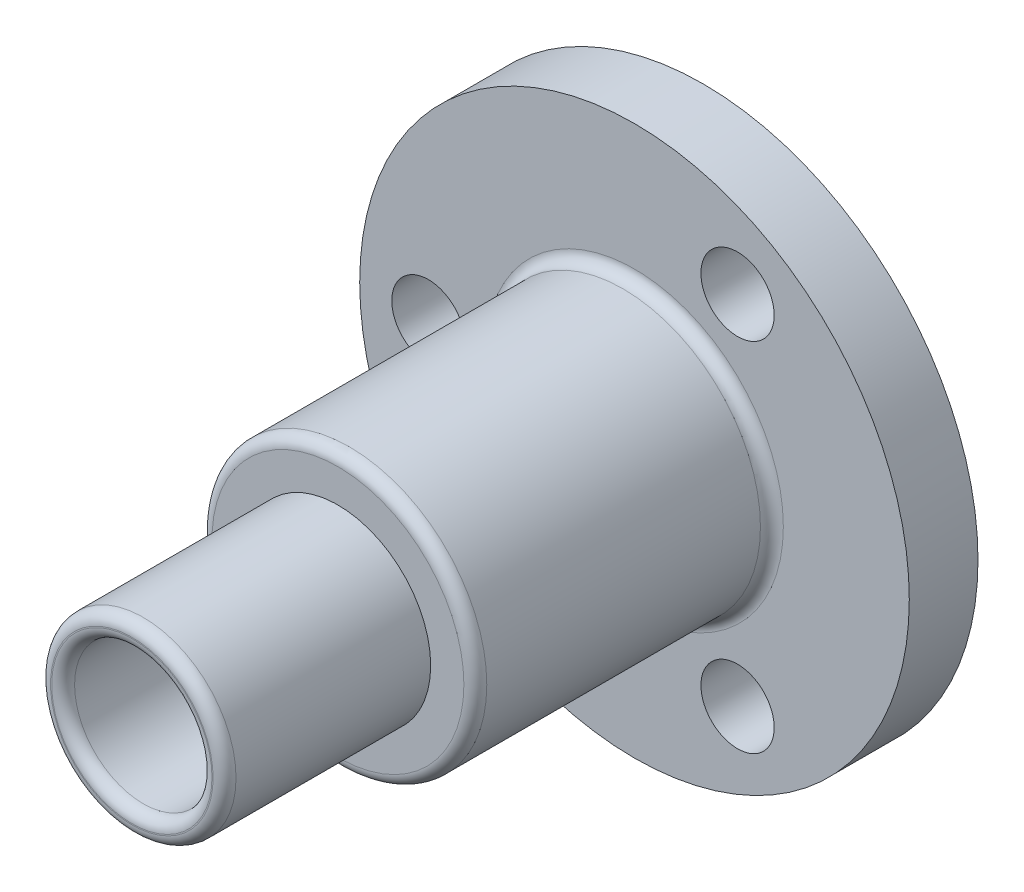
ISO-10303-21;
HEADER;
FILE_DESCRIPTION(('STEP AP214'),'2;1');
FILE_NAME('part.step','',(''),(''),'','','');
FILE_SCHEMA(('AUTOMOTIVE_DESIGN { 1 0 10303 214 1 1 1 1 }'));
ENDSEC;
DATA;
#1=APPLICATION_CONTEXT('core data for automotive mechanical design processes');
#2=APPLICATION_PROTOCOL_DEFINITION('international standard','automotive_design',2000,#1);
#3=PRODUCT_CONTEXT('',#1,'mechanical');
#4=PRODUCT('Part','Part','',(#3));
#5=PRODUCT_RELATED_PRODUCT_CATEGORY('part','',(#4));
#6=PRODUCT_DEFINITION_FORMATION('','',#4);
#7=PRODUCT_DEFINITION_CONTEXT('part definition',#1,'design');
#8=PRODUCT_DEFINITION('design','',#6,#7);
#9=PRODUCT_DEFINITION_SHAPE('','',#8);
#10=(LENGTH_UNIT() NAMED_UNIT(*) SI_UNIT(.MILLI.,.METRE.));
#11=(NAMED_UNIT(*) PLANE_ANGLE_UNIT() SI_UNIT($,.RADIAN.));
#12=(NAMED_UNIT(*) SI_UNIT($,.STERADIAN.) SOLID_ANGLE_UNIT());
#13=UNCERTAINTY_MEASURE_WITH_UNIT(LENGTH_MEASURE(1.E-05),#10,'distance_accuracy_value','');
#14=(GEOMETRIC_REPRESENTATION_CONTEXT(3) GLOBAL_UNCERTAINTY_ASSIGNED_CONTEXT((#13)) GLOBAL_UNIT_ASSIGNED_CONTEXT((#10,
#11,#12)) REPRESENTATION_CONTEXT('',''));
#15=CARTESIAN_POINT('',(0.,0.,0.));
#16=DIRECTION('',(0.,0.,1.));
#17=DIRECTION('',(1.,0.,0.));
#18=AXIS2_PLACEMENT_3D('',#15,#16,#17);
#19=CARTESIAN_POINT('',(0.,0.,3.));
#20=DIRECTION('',(0.,0.,1.));
#21=DIRECTION('',(1.,0.,0.));
#22=AXIS2_PLACEMENT_3D('',#19,#20,#21);
#23=PLANE('',#22);
#24=CARTESIAN_POINT('',(0.,0.,3.));
#25=DIRECTION('',(0.,0.,1.));
#26=DIRECTION('',(1.,0.,0.));
#27=AXIS2_PLACEMENT_3D('',#24,#25,#26);
#28=CIRCLE('',#27,6.5);
#29=CARTESIAN_POINT('',(6.5,0.,3.));
#30=VERTEX_POINT('',#29);
#31=EDGE_CURVE('E10',#30,#30,#28,.F.);
#32=ORIENTED_EDGE('',*,*,#31,.T.);
#33=EDGE_LOOP('',(#32));
#34=FACE_BOUND('',#33,.T.);
#35=CARTESIAN_POINT('',(4.49999999999978,7.79422863406033,3.));
#36=DIRECTION('',(0.,0.,1.));
#37=DIRECTION('',(1.,0.,0.));
#38=AXIS2_PLACEMENT_3D('',#35,#36,#37);
#39=CIRCLE('',#38,1.60000000000034);
#40=CARTESIAN_POINT('',(6.10000000000012,7.79422863406033,3.));
#41=VERTEX_POINT('',#40);
#42=EDGE_CURVE('E106',#41,#41,#39,.T.);
#43=ORIENTED_EDGE('',*,*,#42,.F.);
#44=EDGE_LOOP('',(#43));
#45=FACE_BOUND('',#44,.T.);
#46=CARTESIAN_POINT('',(-9.,0.,3.));
#47=DIRECTION('',(0.,0.,1.));
#48=DIRECTION('',(1.,0.,0.));
#49=AXIS2_PLACEMENT_3D('',#46,#47,#48);
#50=CIRCLE('',#49,1.6);
#51=CARTESIAN_POINT('',(-7.4,0.,3.));
#52=VERTEX_POINT('',#51);
#53=EDGE_CURVE('E93',#52,#52,#50,.T.);
#54=ORIENTED_EDGE('',*,*,#53,.F.);
#55=EDGE_LOOP('',(#54));
#56=FACE_BOUND('',#55,.T.);
#57=CARTESIAN_POINT('',(0.,0.,3.));
#58=DIRECTION('',(0.,0.,1.));
#59=DIRECTION('',(1.,0.,0.));
#60=AXIS2_PLACEMENT_3D('',#57,#58,#59);
#61=CIRCLE('',#60,12.);
#62=CARTESIAN_POINT('',(12.,0.,3.));
#63=VERTEX_POINT('',#62);
#64=EDGE_CURVE('E89',#63,#63,#61,.T.);
#65=ORIENTED_EDGE('',*,*,#64,.T.);
#66=EDGE_LOOP('',(#65));
#67=FACE_BOUND('',#66,.T.);
#68=CARTESIAN_POINT('',(4.50000000000022,-7.79422863405957,3.));
#69=DIRECTION('',(0.,0.,1.));
#70=DIRECTION('',(1.,0.,0.));
#71=AXIS2_PLACEMENT_3D('',#68,#69,#70);
#72=CIRCLE('',#71,1.60000000000051);
#73=CARTESIAN_POINT('',(6.10000000000072,-7.79422863405957,3.));
#74=VERTEX_POINT('',#73);
#75=EDGE_CURVE('E117',#74,#74,#72,.T.);
#76=ORIENTED_EDGE('',*,*,#75,.F.);
#77=EDGE_LOOP('',(#76));
#78=FACE_BOUND('',#77,.T.);
#79=ADVANCED_FACE('F44',(#34,#45,#56,#67,#78),#23,.T.);
#80=CARTESIAN_POINT('',(0.,0.,0.));
#81=DIRECTION('',(0.,0.,1.));
#82=DIRECTION('',(1.,0.,0.));
#83=AXIS2_PLACEMENT_3D('',#80,#81,#82);
#84=PLANE('',#83);
#85=CARTESIAN_POINT('',(0.,0.,0.));
#86=DIRECTION('',(0.,0.,1.));
#87=DIRECTION('',(1.,0.,0.));
#88=AXIS2_PLACEMENT_3D('',#85,#86,#87);
#89=CIRCLE('',#88,12.);
#90=CARTESIAN_POINT('',(12.,0.,0.));
#91=VERTEX_POINT('',#90);
#92=EDGE_CURVE('E88',#91,#91,#89,.T.);
#93=ORIENTED_EDGE('',*,*,#92,.F.);
#94=EDGE_LOOP('',(#93));
#95=FACE_BOUND('',#94,.T.);
#96=CARTESIAN_POINT('',(-9.,0.,0.));
#97=DIRECTION('',(0.,0.,1.));
#98=DIRECTION('',(1.,0.,0.));
#99=AXIS2_PLACEMENT_3D('',#96,#97,#98);
#100=CIRCLE('',#99,1.6);
#101=CARTESIAN_POINT('',(-7.4,0.,0.));
#102=VERTEX_POINT('',#101);
#103=EDGE_CURVE('E92',#102,#102,#100,.T.);
#104=ORIENTED_EDGE('',*,*,#103,.T.);
#105=EDGE_LOOP('',(#104));
#106=FACE_BOUND('',#105,.T.);
#107=CARTESIAN_POINT('',(0.,0.,0.));
#108=DIRECTION('',(0.,0.,1.));
#109=DIRECTION('',(1.,0.,0.));
#110=AXIS2_PLACEMENT_3D('',#107,#108,#109);
#111=CIRCLE('',#110,3.5);
#112=CARTESIAN_POINT('',(3.5,0.,0.));
#113=VERTEX_POINT('',#112);
#114=EDGE_CURVE('E97',#113,#113,#111,.T.);
#115=ORIENTED_EDGE('',*,*,#114,.T.);
#116=EDGE_LOOP('',(#115));
#117=FACE_BOUND('',#116,.T.);
#118=CARTESIAN_POINT('',(4.49999999999978,7.79422863406033,0.));
#119=DIRECTION('',(0.,0.,1.));
#120=DIRECTION('',(1.,0.,0.));
#121=AXIS2_PLACEMENT_3D('',#118,#119,#120);
#122=CIRCLE('',#121,1.60000000000034);
#123=CARTESIAN_POINT('',(6.10000000000012,7.79422863406033,0.));
#124=VERTEX_POINT('',#123);
#125=EDGE_CURVE('E114',#124,#124,#122,.T.);
#126=ORIENTED_EDGE('',*,*,#125,.T.);
#127=EDGE_LOOP('',(#126));
#128=FACE_BOUND('',#127,.T.);
#129=CARTESIAN_POINT('',(4.50000000000022,-7.79422863405957,0.));
#130=DIRECTION('',(0.,0.,1.));
#131=DIRECTION('',(1.,0.,0.));
#132=AXIS2_PLACEMENT_3D('',#129,#130,#131);
#133=CIRCLE('',#132,1.60000000000051);
#134=CARTESIAN_POINT('',(6.10000000000072,-7.79422863405957,0.));
#135=VERTEX_POINT('',#134);
#136=EDGE_CURVE('E112',#135,#135,#133,.T.);
#137=ORIENTED_EDGE('',*,*,#136,.T.);
#138=EDGE_LOOP('',(#137));
#139=FACE_BOUND('',#138,.T.);
#140=ADVANCED_FACE('F154',(#95,#106,#117,#128,#139),#84,.F.);
#141=CARTESIAN_POINT('',(0.,0.,3.));
#142=DIRECTION('',(0.,0.,-1.));
#143=DIRECTION('',(-1.,0.,0.));
#144=AXIS2_PLACEMENT_3D('',#141,#142,#143);
#145=CYLINDRICAL_SURFACE('',#144,12.);
#146=ORIENTED_EDGE('',*,*,#64,.F.);
#147=EDGE_LOOP('',(#146));
#148=FACE_BOUND('',#147,.T.);
#149=ORIENTED_EDGE('',*,*,#92,.T.);
#150=EDGE_LOOP('',(#149));
#151=FACE_BOUND('',#150,.T.);
#152=ADVANCED_FACE('F159',(#148,#151),#145,.T.);
#153=CARTESIAN_POINT('',(-9.,0.,3.));
#154=DIRECTION('',(0.,0.,-1.));
#155=DIRECTION('',(-1.,0.,0.));
#156=AXIS2_PLACEMENT_3D('',#153,#154,#155);
#157=CYLINDRICAL_SURFACE('',#156,1.6);
#158=ORIENTED_EDGE('',*,*,#53,.T.);
#159=EDGE_LOOP('',(#158));
#160=FACE_BOUND('',#159,.T.);
#161=ORIENTED_EDGE('',*,*,#103,.F.);
#162=EDGE_LOOP('',(#161));
#163=FACE_BOUND('',#162,.T.);
#164=ADVANCED_FACE('F164',(#160,#163),#157,.F.);
#165=CARTESIAN_POINT('',(0.,0.,3.));
#166=DIRECTION('',(0.,0.,-1.));
#167=DIRECTION('',(-1.,0.,0.));
#168=AXIS2_PLACEMENT_3D('',#165,#166,#167);
#169=CYLINDRICAL_SURFACE('',#168,3.5);
#170=CARTESIAN_POINT('',(0.,0.,3.));
#171=DIRECTION('',(0.,0.,1.));
#172=DIRECTION('',(1.,0.,0.));
#173=AXIS2_PLACEMENT_3D('',#170,#171,#172);
#174=CIRCLE('',#173,3.5);
#175=CARTESIAN_POINT('',(3.5,0.,3.));
#176=VERTEX_POINT('',#175);
#177=EDGE_CURVE('E110',#176,#176,#174,.T.);
#178=ORIENTED_EDGE('',*,*,#177,.T.);
#179=EDGE_LOOP('',(#178));
#180=FACE_BOUND('',#179,.T.);
#181=ORIENTED_EDGE('',*,*,#114,.F.);
#182=EDGE_LOOP('',(#181));
#183=FACE_BOUND('',#182,.T.);
#184=ADVANCED_FACE('F203',(#180,#183),#169,.F.);
#185=CARTESIAN_POINT('',(4.49999999999978,7.79422863406033,3.));
#186=DIRECTION('',(0.,0.,-1.));
#187=DIRECTION('',(-1.,0.,0.));
#188=AXIS2_PLACEMENT_3D('',#185,#186,#187);
#189=CYLINDRICAL_SURFACE('',#188,1.60000000000034);
#190=ORIENTED_EDGE('',*,*,#42,.T.);
#191=EDGE_LOOP('',(#190));
#192=FACE_BOUND('',#191,.T.);
#193=ORIENTED_EDGE('',*,*,#125,.F.);
#194=EDGE_LOOP('',(#193));
#195=FACE_BOUND('',#194,.T.);
#196=ADVANCED_FACE('F151',(#192,#195),#189,.F.);
#197=CARTESIAN_POINT('',(4.50000000000022,-7.79422863405957,3.));
#198=DIRECTION('',(0.,0.,-1.));
#199=DIRECTION('',(-1.,0.,0.));
#200=AXIS2_PLACEMENT_3D('',#197,#198,#199);
#201=CYLINDRICAL_SURFACE('',#200,1.60000000000051);
#202=ORIENTED_EDGE('',*,*,#75,.T.);
#203=EDGE_LOOP('',(#202));
#204=FACE_BOUND('',#203,.T.);
#205=ORIENTED_EDGE('',*,*,#136,.F.);
#206=EDGE_LOOP('',(#205));
#207=FACE_BOUND('',#206,.T.);
#208=ADVANCED_FACE('F137',(#204,#207),#201,.F.);
#209=CARTESIAN_POINT('',(0.,0.,15.95));
#210=DIRECTION('',(0.,0.,1.));
#211=DIRECTION('',(1.,0.,0.));
#212=AXIS2_PLACEMENT_3D('',#209,#210,#211);
#213=PLANE('',#212);
#214=CARTESIAN_POINT('',(0.,0.,15.95));
#215=DIRECTION('',(0.,0.,1.));
#216=DIRECTION('',(1.,0.,0.));
#217=AXIS2_PLACEMENT_3D('',#214,#215,#216);
#218=CIRCLE('',#217,5.5);
#219=CARTESIAN_POINT('',(5.5,0.,15.95));
#220=VERTEX_POINT('',#219);
#221=EDGE_CURVE('E64',#220,#220,#218,.T.);
#222=ORIENTED_EDGE('',*,*,#221,.T.);
#223=EDGE_LOOP('',(#222));
#224=FACE_BOUND('',#223,.T.);
#225=CARTESIAN_POINT('',(0.,0.,15.95));
#226=DIRECTION('',(0.,0.,1.));
#227=DIRECTION('',(1.,0.,0.));
#228=AXIS2_PLACEMENT_3D('',#225,#226,#227);
#229=CIRCLE('',#228,4.05);
#230=CARTESIAN_POINT('',(4.05,0.,15.95));
#231=VERTEX_POINT('',#230);
#232=EDGE_CURVE('E84',#231,#231,#229,.T.);
#233=ORIENTED_EDGE('',*,*,#232,.F.);
#234=EDGE_LOOP('',(#233));
#235=FACE_BOUND('',#234,.T.);
#236=ADVANCED_FACE('F138',(#224,#235),#213,.T.);
#237=CARTESIAN_POINT('',(0.,0.,3.));
#238=DIRECTION('',(0.,0.,1.));
#239=DIRECTION('',(1.,0.,0.));
#240=AXIS2_PLACEMENT_3D('',#237,#238,#239);
#241=PLANE('',#240);
#242=ORIENTED_EDGE('',*,*,#177,.F.);
#243=EDGE_LOOP('',(#242));
#244=FACE_BOUND('',#243,.T.);
#245=CARTESIAN_POINT('',(0.,0.,3.));
#246=DIRECTION('',(0.,0.,1.));
#247=DIRECTION('',(1.,0.,0.));
#248=AXIS2_PLACEMENT_3D('',#245,#246,#247);
#249=CIRCLE('',#248,3.);
#250=CARTESIAN_POINT('',(-3.,0.,3.));
#251=VERTEX_POINT('',#250);
#252=EDGE_CURVE('E115',#251,#251,#249,.T.);
#253=ORIENTED_EDGE('',*,*,#252,.T.);
#254=EDGE_LOOP('',(#253));
#255=FACE_BOUND('',#254,.T.);
#256=ADVANCED_FACE('F136',(#244,#255),#241,.F.);
#257=CARTESIAN_POINT('',(0.,0.,15.95));
#258=DIRECTION('',(0.,0.,-1.));
#259=DIRECTION('',(-1.,0.,0.));
#260=AXIS2_PLACEMENT_3D('',#257,#258,#259);
#261=CYLINDRICAL_SURFACE('',#260,6.);
#262=CARTESIAN_POINT('',(0.,0.,15.45));
#263=DIRECTION('',(0.,0.,1.));
#264=DIRECTION('',(1.,0.,0.));
#265=AXIS2_PLACEMENT_3D('',#262,#263,#264);
#266=CIRCLE('',#265,6.);
#267=CARTESIAN_POINT('',(-6.,0.,15.45));
#268=VERTEX_POINT('',#267);
#269=EDGE_CURVE('E52',#268,#268,#266,.F.);
#270=CARTESIAN_POINT('',(0.,0.,3.5));
#271=DIRECTION('',(0.,0.,1.));
#272=DIRECTION('',(1.,0.,0.));
#273=AXIS2_PLACEMENT_3D('',#270,#271,#272);
#274=CIRCLE('',#273,6.);
#275=CARTESIAN_POINT('',(-6.,0.,3.5));
#276=VERTEX_POINT('',#275);
#277=EDGE_CURVE('E59',#276,#276,#274,.T.);
#278=CARTESIAN_POINT('',(-6.,0.,15.45));
#279=CARTESIAN_POINT('',(-6.,0.,15.3255208333333));
#280=CARTESIAN_POINT('',(-6.,0.,15.2010416666667));
#281=CARTESIAN_POINT('',(-6.,0.,14.9520833333333));
#282=CARTESIAN_POINT('',(-6.,0.,14.8276041666667));
#283=CARTESIAN_POINT('',(-6.,0.,14.5786458333333));
#284=CARTESIAN_POINT('',(-6.,0.,14.4541666666667));
#285=CARTESIAN_POINT('',(-6.,0.,14.2052083333333));
#286=CARTESIAN_POINT('',(-6.,0.,14.0807291666667));
#287=CARTESIAN_POINT('',(-6.,0.,13.8317708333333));
#288=CARTESIAN_POINT('',(-6.,0.,13.7072916666667));
#289=CARTESIAN_POINT('',(-6.,0.,13.4583333333333));
#290=CARTESIAN_POINT('',(-6.,0.,13.3338541666667));
#291=CARTESIAN_POINT('',(-6.,0.,13.0848958333333));
#292=CARTESIAN_POINT('',(-6.,0.,12.9604166666667));
#293=CARTESIAN_POINT('',(-6.,0.,12.7114583333333));
#294=CARTESIAN_POINT('',(-6.,0.,12.5869791666667));
#295=CARTESIAN_POINT('',(-6.,0.,12.3380208333333));
#296=CARTESIAN_POINT('',(-6.,0.,12.2135416666667));
#297=CARTESIAN_POINT('',(-6.,0.,11.9645833333333));
#298=CARTESIAN_POINT('',(-6.,0.,11.8401041666667));
#299=CARTESIAN_POINT('',(-6.,0.,11.5911458333333));
#300=CARTESIAN_POINT('',(-6.,0.,11.4666666666667));
#301=CARTESIAN_POINT('',(-6.,0.,11.2177083333333));
#302=CARTESIAN_POINT('',(-6.,0.,11.0932291666667));
#303=CARTESIAN_POINT('',(-6.,0.,10.8442708333333));
#304=CARTESIAN_POINT('',(-6.,0.,10.7197916666667));
#305=CARTESIAN_POINT('',(-6.,0.,10.4708333333333));
#306=CARTESIAN_POINT('',(-6.,0.,10.3463541666667));
#307=CARTESIAN_POINT('',(-6.,0.,10.0973958333333));
#308=CARTESIAN_POINT('',(-6.,0.,9.97291666666666));
#309=CARTESIAN_POINT('',(-6.,0.,9.72395833333333));
#310=CARTESIAN_POINT('',(-6.,0.,9.59947916666667));
#311=CARTESIAN_POINT('',(-6.,0.,9.35052083333333));
#312=CARTESIAN_POINT('',(-6.,0.,9.22604166666667));
#313=CARTESIAN_POINT('',(-6.,0.,8.97708333333333));
#314=CARTESIAN_POINT('',(-6.,0.,8.85260416666667));
#315=CARTESIAN_POINT('',(-6.,0.,8.60364583333333));
#316=CARTESIAN_POINT('',(-6.,0.,8.47916666666667));
#317=CARTESIAN_POINT('',(-6.,0.,8.23020833333333));
#318=CARTESIAN_POINT('',(-6.,0.,8.10572916666667));
#319=CARTESIAN_POINT('',(-6.,0.,7.85677083333333));
#320=CARTESIAN_POINT('',(-6.,0.,7.73229166666667));
#321=CARTESIAN_POINT('',(-6.,0.,7.48333333333333));
#322=CARTESIAN_POINT('',(-6.,0.,7.35885416666666));
#323=CARTESIAN_POINT('',(-6.,0.,7.10989583333333));
#324=CARTESIAN_POINT('',(-6.,0.,6.98541666666666));
#325=CARTESIAN_POINT('',(-6.,0.,6.73645833333333));
#326=CARTESIAN_POINT('',(-6.,0.,6.61197916666666));
#327=CARTESIAN_POINT('',(-6.,0.,6.36302083333333));
#328=CARTESIAN_POINT('',(-6.,0.,6.23854166666666));
#329=CARTESIAN_POINT('',(-6.,0.,5.98958333333333));
#330=CARTESIAN_POINT('',(-6.,0.,5.86510416666666));
#331=CARTESIAN_POINT('',(-6.,0.,5.61614583333333));
#332=CARTESIAN_POINT('',(-6.,0.,5.49166666666666));
#333=CARTESIAN_POINT('',(-6.,0.,5.24270833333333));
#334=CARTESIAN_POINT('',(-6.,0.,5.11822916666666));
#335=CARTESIAN_POINT('',(-6.,0.,4.86927083333333));
#336=CARTESIAN_POINT('',(-6.,0.,4.74479166666666));
#337=CARTESIAN_POINT('',(-6.,0.,4.49583333333333));
#338=CARTESIAN_POINT('',(-6.,0.,4.37135416666666));
#339=CARTESIAN_POINT('',(-6.,0.,4.12239583333333));
#340=CARTESIAN_POINT('',(-6.,0.,3.99791666666666));
#341=CARTESIAN_POINT('',(-6.,0.,3.74895833333333));
#342=CARTESIAN_POINT('',(-6.,0.,3.62447916666666));
#343=CARTESIAN_POINT('',(-6.,0.,3.5));
#344=B_SPLINE_CURVE_WITH_KNOTS('',3,(#278,#279,#280,#281,#282,#283,#284,#285,#286,#287,#288,
#289,#290,#291,#292,#293,#294,#295,#296,#297,#298,#299,#300,#301,#302,#303,#304,#305,#306,#307,
#308,#309,#310,#311,#312,#313,#314,#315,#316,#317,#318,#319,#320,#321,#322,#323,#324,#325,#326,
#327,#328,#329,#330,#331,#332,#333,#334,#335,#336,#337,#338,#339,#340,#341,#342,#343),
.UNSPECIFIED.,.F.,.F.,(4,2,2,2,2,2,2,2,2,2,2,2,2,2,2,2,2,2,2,2,2,2,2,2,2,2,2,2,2,2,2,2,4),(0.,
0.373437499999999,0.746874999999999,1.1203125,1.49375,1.8671875,2.240625,2.6140625,2.9875,
3.3609375,3.734375,4.1078125,4.48125,4.8546875,5.228125,5.6015625,5.975,6.3484375,6.721875,
7.0953125,7.46875,7.8421875,8.215625,8.5890625,8.9625,9.3359375,9.709375,10.0828125,10.45625,
10.8296875,11.203125,11.5765625,11.95),.UNSPECIFIED.);
#345=EDGE_CURVE('BSEAM150',#268,#276,#344,.T.);
#346=ORIENTED_EDGE('',*,*,#269,.T.);
#347=ORIENTED_EDGE('',*,*,#277,.T.);
#348=ORIENTED_EDGE('',*,*,#345,.T.);
#349=ORIENTED_EDGE('',*,*,#345,.F.);
#350=EDGE_LOOP('',(#346,#348,#347,#349));
#351=FACE_BOUND('',#350,.T.);
#352=ADVANCED_FACE('F150',(#351),#261,.T.);
#353=CARTESIAN_POINT('',(0.,0.,15.95));
#354=DIRECTION('',(0.,0.,-1.));
#355=DIRECTION('',(-1.,0.,0.));
#356=AXIS2_PLACEMENT_3D('',#353,#354,#355);
#357=CYLINDRICAL_SURFACE('',#356,3.);
#358=CARTESIAN_POINT('',(0.,0.,24.45));
#359=DIRECTION('',(0.,0.,1.));
#360=DIRECTION('',(1.,0.,0.));
#361=AXIS2_PLACEMENT_3D('',#358,#359,#360);
#362=CIRCLE('',#361,3.);
#363=CARTESIAN_POINT('',(-3.,0.,24.45));
#364=VERTEX_POINT('',#363);
#365=EDGE_CURVE('E83',#364,#364,#362,.T.);
#366=CARTESIAN_POINT('',(-3.,0.,24.45));
#367=CARTESIAN_POINT('',(-3.,0.,24.2265625));
#368=CARTESIAN_POINT('',(-3.,0.,24.003125));
#369=CARTESIAN_POINT('',(-3.,0.,23.55625));
#370=CARTESIAN_POINT('',(-3.,0.,23.3328125));
#371=CARTESIAN_POINT('',(-3.,0.,22.8859375));
#372=CARTESIAN_POINT('',(-3.,0.,22.6625));
#373=CARTESIAN_POINT('',(-3.,0.,22.215625));
#374=CARTESIAN_POINT('',(-3.,0.,21.9921875));
#375=CARTESIAN_POINT('',(-3.,0.,21.5453125));
#376=CARTESIAN_POINT('',(-3.,0.,21.321875));
#377=CARTESIAN_POINT('',(-3.,0.,20.875));
#378=CARTESIAN_POINT('',(-3.,0.,20.6515625));
#379=CARTESIAN_POINT('',(-3.,0.,20.2046875));
#380=CARTESIAN_POINT('',(-3.,0.,19.98125));
#381=CARTESIAN_POINT('',(-3.,0.,19.534375));
#382=CARTESIAN_POINT('',(-3.,0.,19.3109375));
#383=CARTESIAN_POINT('',(-3.,0.,18.8640625));
#384=CARTESIAN_POINT('',(-3.,0.,18.640625));
#385=CARTESIAN_POINT('',(-3.,0.,18.19375));
#386=CARTESIAN_POINT('',(-3.,0.,17.9703125));
#387=CARTESIAN_POINT('',(-3.,0.,17.5234375));
#388=CARTESIAN_POINT('',(-3.,0.,17.3));
#389=CARTESIAN_POINT('',(-3.,0.,16.853125));
#390=CARTESIAN_POINT('',(-3.,0.,16.6296875));
#391=CARTESIAN_POINT('',(-3.,0.,16.1828125));
#392=CARTESIAN_POINT('',(-3.,0.,15.959375));
#393=CARTESIAN_POINT('',(-3.,0.,15.5125));
#394=CARTESIAN_POINT('',(-3.,0.,15.2890625));
#395=CARTESIAN_POINT('',(-3.,0.,14.8421875));
#396=CARTESIAN_POINT('',(-3.,0.,14.61875));
#397=CARTESIAN_POINT('',(-3.,0.,14.171875));
#398=CARTESIAN_POINT('',(-3.,0.,13.9484375));
#399=CARTESIAN_POINT('',(-3.,0.,13.5015625));
#400=CARTESIAN_POINT('',(-3.,0.,13.278125));
#401=CARTESIAN_POINT('',(-3.,0.,12.83125));
#402=CARTESIAN_POINT('',(-3.,0.,12.6078125));
#403=CARTESIAN_POINT('',(-3.,0.,12.1609375));
#404=CARTESIAN_POINT('',(-3.,0.,11.9375));
#405=CARTESIAN_POINT('',(-3.,0.,11.490625));
#406=CARTESIAN_POINT('',(-3.,0.,11.2671875));
#407=CARTESIAN_POINT('',(-3.,0.,10.8203125));
#408=CARTESIAN_POINT('',(-3.,0.,10.596875));
#409=CARTESIAN_POINT('',(-3.,0.,10.15));
#410=CARTESIAN_POINT('',(-3.,0.,9.9265625));
#411=CARTESIAN_POINT('',(-3.,0.,9.4796875));
#412=CARTESIAN_POINT('',(-3.,0.,9.25625));
#413=CARTESIAN_POINT('',(-3.,0.,8.809375));
#414=CARTESIAN_POINT('',(-3.,0.,8.5859375));
#415=CARTESIAN_POINT('',(-3.,0.,8.1390625));
#416=CARTESIAN_POINT('',(-3.,0.,7.915625));
#417=CARTESIAN_POINT('',(-3.,0.,7.46875));
#418=CARTESIAN_POINT('',(-3.,0.,7.2453125));
#419=CARTESIAN_POINT('',(-3.,0.,6.7984375));
#420=CARTESIAN_POINT('',(-3.,0.,6.575));
#421=CARTESIAN_POINT('',(-3.,0.,6.128125));
#422=CARTESIAN_POINT('',(-3.,0.,5.9046875));
#423=CARTESIAN_POINT('',(-3.,0.,5.4578125));
#424=CARTESIAN_POINT('',(-3.,0.,5.234375));
#425=CARTESIAN_POINT('',(-3.,0.,4.7875));
#426=CARTESIAN_POINT('',(-3.,0.,4.5640625));
#427=CARTESIAN_POINT('',(-3.,0.,4.1171875));
#428=CARTESIAN_POINT('',(-3.,0.,3.89375));
#429=CARTESIAN_POINT('',(-3.,0.,3.446875));
#430=CARTESIAN_POINT('',(-3.,0.,3.2234375));
#431=CARTESIAN_POINT('',(-3.,0.,3.));
#432=B_SPLINE_CURVE_WITH_KNOTS('',3,(#366,#367,#368,#369,#370,#371,#372,#373,#374,#375,#376,
#377,#378,#379,#380,#381,#382,#383,#384,#385,#386,#387,#388,#389,#390,#391,#392,#393,#394,#395,
#396,#397,#398,#399,#400,#401,#402,#403,#404,#405,#406,#407,#408,#409,#410,#411,#412,#413,#414,
#415,#416,#417,#418,#419,#420,#421,#422,#423,#424,#425,#426,#427,#428,#429,#430,#431),
.UNSPECIFIED.,.F.,.F.,(4,2,2,2,2,2,2,2,2,2,2,2,2,2,2,2,2,2,2,2,2,2,2,2,2,2,2,2,2,2,2,2,4),(0.,
0.670312500000003,1.340625,2.0109375,2.68125,3.3515625,4.021875,4.6921875,5.3625,6.0328125,
6.703125,7.3734375,8.04375,8.7140625,9.384375,10.0546875,10.725,11.3953125,12.065625,12.7359375,
13.40625,14.0765625,14.746875,15.4171875,16.0875,16.7578125,17.428125,18.0984375,18.76875,
19.4390625,20.109375,20.7796875,21.45),.UNSPECIFIED.);
#433=EDGE_CURVE('BSEAM195',#364,#251,#432,.T.);
#434=ORIENTED_EDGE('',*,*,#365,.T.);
#435=ORIENTED_EDGE('',*,*,#252,.F.);
#436=ORIENTED_EDGE('',*,*,#433,.T.);
#437=ORIENTED_EDGE('',*,*,#433,.F.);
#438=EDGE_LOOP('',(#434,#436,#435,#437));
#439=FACE_BOUND('',#438,.T.);
#440=ADVANCED_FACE('F195',(#439),#357,.F.);
#441=CARTESIAN_POINT('',(0.,0.,24.95));
#442=DIRECTION('',(0.,0.,1.));
#443=DIRECTION('',(1.,0.,0.));
#444=AXIS2_PLACEMENT_3D('',#441,#442,#443);
#445=PLANE('',#444);
#446=CARTESIAN_POINT('',(0.,0.,24.95));
#447=DIRECTION('',(0.,0.,1.));
#448=DIRECTION('',(1.,0.,0.));
#449=AXIS2_PLACEMENT_3D('',#446,#447,#448);
#450=CIRCLE('',#449,3.5);
#451=CARTESIAN_POINT('',(3.5,0.,24.95));
#452=VERTEX_POINT('',#451);
#453=EDGE_CURVE('E71',#452,#452,#450,.F.);
#454=ORIENTED_EDGE('',*,*,#453,.T.);
#455=EDGE_LOOP('',(#454));
#456=FACE_BOUND('',#455,.T.);
#457=CARTESIAN_POINT('',(0.,0.,24.95));
#458=DIRECTION('',(0.,0.,1.));
#459=DIRECTION('',(1.,0.,0.));
#460=AXIS2_PLACEMENT_3D('',#457,#458,#459);
#461=CIRCLE('',#460,3.55);
#462=CARTESIAN_POINT('',(3.55,0.,24.95));
#463=VERTEX_POINT('',#462);
#464=EDGE_CURVE('E77',#463,#463,#461,.T.);
#465=ORIENTED_EDGE('',*,*,#464,.T.);
#466=EDGE_LOOP('',(#465));
#467=FACE_BOUND('',#466,.T.);
#468=ADVANCED_FACE('F197',(#456,#467),#445,.T.);
#469=CARTESIAN_POINT('',(0.,0.,24.95));
#470=DIRECTION('',(0.,0.,-1.));
#471=DIRECTION('',(-1.,0.,0.));
#472=AXIS2_PLACEMENT_3D('',#469,#470,#471);
#473=CYLINDRICAL_SURFACE('',#472,4.05);
#474=CARTESIAN_POINT('',(0.,0.,24.45));
#475=DIRECTION('',(0.,0.,1.));
#476=DIRECTION('',(1.,0.,0.));
#477=AXIS2_PLACEMENT_3D('',#474,#475,#476);
#478=CIRCLE('',#477,4.05);
#479=CARTESIAN_POINT('',(4.05,0.,24.45));
#480=VERTEX_POINT('',#479);
#481=EDGE_CURVE('E67',#480,#480,#478,.F.);
#482=ORIENTED_EDGE('',*,*,#481,.T.);
#483=EDGE_LOOP('',(#482));
#484=FACE_BOUND('',#483,.T.);
#485=ORIENTED_EDGE('',*,*,#232,.T.);
#486=EDGE_LOOP('',(#485));
#487=FACE_BOUND('',#486,.T.);
#488=ADVANCED_FACE('F133',(#484,#487),#473,.T.);
#489=CARTESIAN_POINT('',(0.,0.,24.45));
#490=DIRECTION('',(0.,0.,1.));
#491=DIRECTION('',(1.,0.,0.));
#492=AXIS2_PLACEMENT_3D('',#489,#490,#491);
#493=TOROIDAL_SURFACE('',#492,3.5,0.5);
#494=ORIENTED_EDGE('',*,*,#453,.F.);
#495=EDGE_LOOP('',(#494));
#496=FACE_BOUND('',#495,.T.);
#497=ORIENTED_EDGE('',*,*,#365,.F.);
#498=EDGE_LOOP('',(#497));
#499=FACE_BOUND('',#498,.T.);
#500=ADVANCED_FACE('F171',(#496,#499),#493,.T.);
#501=CARTESIAN_POINT('',(0.,0.,24.45));
#502=DIRECTION('',(0.,0.,1.));
#503=DIRECTION('',(1.,0.,0.));
#504=AXIS2_PLACEMENT_3D('',#501,#502,#503);
#505=TOROIDAL_SURFACE('',#504,3.55,0.5);
#506=ORIENTED_EDGE('',*,*,#481,.F.);
#507=EDGE_LOOP('',(#506));
#508=FACE_BOUND('',#507,.T.);
#509=ORIENTED_EDGE('',*,*,#464,.F.);
#510=EDGE_LOOP('',(#509));
#511=FACE_BOUND('',#510,.T.);
#512=ADVANCED_FACE('F173',(#508,#511),#505,.T.);
#513=CARTESIAN_POINT('',(0.,0.,15.45));
#514=DIRECTION('',(0.,0.,1.));
#515=DIRECTION('',(1.,0.,0.));
#516=AXIS2_PLACEMENT_3D('',#513,#514,#515);
#517=TOROIDAL_SURFACE('',#516,5.5,0.5);
#518=ORIENTED_EDGE('',*,*,#269,.F.);
#519=EDGE_LOOP('',(#518));
#520=FACE_BOUND('',#519,.T.);
#521=ORIENTED_EDGE('',*,*,#221,.F.);
#522=EDGE_LOOP('',(#521));
#523=FACE_BOUND('',#522,.T.);
#524=ADVANCED_FACE('F180',(#520,#523),#517,.T.);
#525=CARTESIAN_POINT('',(0.,0.,3.5));
#526=DIRECTION('',(0.,0.,1.));
#527=DIRECTION('',(1.,0.,0.));
#528=AXIS2_PLACEMENT_3D('',#525,#526,#527);
#529=TOROIDAL_SURFACE('',#528,6.5,0.5);
#530=ORIENTED_EDGE('',*,*,#31,.F.);
#531=EDGE_LOOP('',(#530));
#532=FACE_BOUND('',#531,.T.);
#533=ORIENTED_EDGE('',*,*,#277,.F.);
#534=EDGE_LOOP('',(#533));
#535=FACE_BOUND('',#534,.T.);
#536=ADVANCED_FACE('F50',(#532,#535),#529,.F.);
#537=CLOSED_SHELL('',(#79,#140,#152,#164,#184,#196,#208,#236,#256,#352,#440,#468,#488,#500,#512,
#524,#536));
#538=MANIFOLD_SOLID_BREP('B2',#537);
#539=ADVANCED_BREP_SHAPE_REPRESENTATION('',(#18,#538),#14);
#540=SHAPE_DEFINITION_REPRESENTATION(#9,#539);
ENDSEC;
END-ISO-10303-21;
